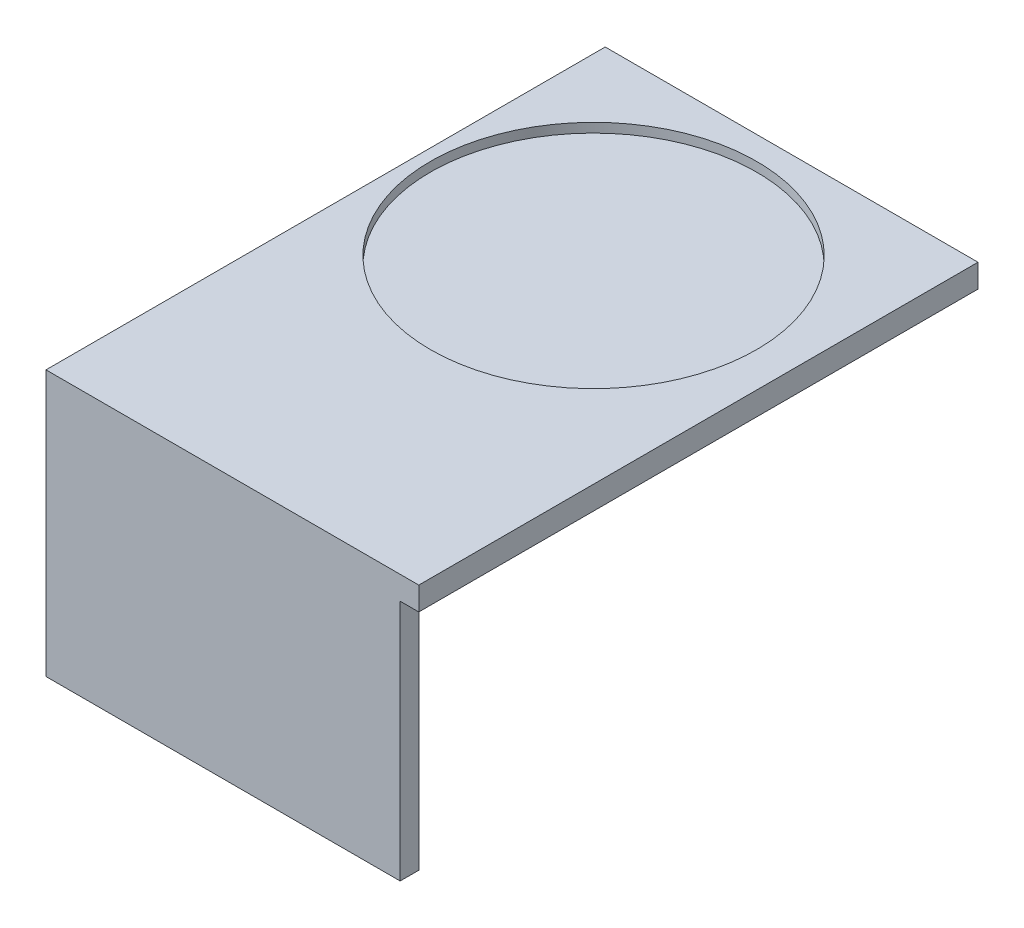
ISO-10303-21;
HEADER;
FILE_DESCRIPTION(('STEP AP214'),'2;1');
FILE_NAME('part.step','',(''),(''),'','','');
FILE_SCHEMA(('AUTOMOTIVE_DESIGN { 1 0 10303 214 1 1 1 1 }'));
ENDSEC;
DATA;
#1=APPLICATION_CONTEXT('core data for automotive mechanical design processes');
#2=APPLICATION_PROTOCOL_DEFINITION('international standard','automotive_design',2000,#1);
#3=PRODUCT_CONTEXT('',#1,'mechanical');
#4=PRODUCT('Part','Part','',(#3));
#5=PRODUCT_RELATED_PRODUCT_CATEGORY('part','',(#4));
#6=PRODUCT_DEFINITION_FORMATION('','',#4);
#7=PRODUCT_DEFINITION_CONTEXT('part definition',#1,'design');
#8=PRODUCT_DEFINITION('design','',#6,#7);
#9=PRODUCT_DEFINITION_SHAPE('','',#8);
#10=(LENGTH_UNIT() NAMED_UNIT(*) SI_UNIT(.MILLI.,.METRE.));
#11=(NAMED_UNIT(*) PLANE_ANGLE_UNIT() SI_UNIT($,.RADIAN.));
#12=(NAMED_UNIT(*) SI_UNIT($,.STERADIAN.) SOLID_ANGLE_UNIT());
#13=UNCERTAINTY_MEASURE_WITH_UNIT(LENGTH_MEASURE(1.E-05),#10,'distance_accuracy_value','');
#14=(GEOMETRIC_REPRESENTATION_CONTEXT(3) GLOBAL_UNCERTAINTY_ASSIGNED_CONTEXT((#13)) GLOBAL_UNIT_ASSIGNED_CONTEXT((#10,
#11,#12)) REPRESENTATION_CONTEXT('',''));
#15=CARTESIAN_POINT('',(0.,0.,0.));
#16=DIRECTION('',(0.,0.,1.));
#17=DIRECTION('',(1.,0.,0.));
#18=AXIS2_PLACEMENT_3D('',#15,#16,#17);
#19=CARTESIAN_POINT('',(0.,0.,0.));
#20=DIRECTION('',(0.,1.,0.));
#21=DIRECTION('',(0.,0.,1.));
#22=AXIS2_PLACEMENT_3D('',#19,#20,#21);
#23=PLANE('',#22);
#24=DIRECTION('',(0.,0.,-1.));
#25=VECTOR('',#24,1.);
#26=CARTESIAN_POINT('',(-33.5,0.,36.));
#27=LINE('',#26,#25);
#28=CARTESIAN_POINT('',(-33.5,0.,36.));
#29=VERTEX_POINT('',#28);
#30=CARTESIAN_POINT('',(-33.5,0.,16.));
#31=VERTEX_POINT('',#30);
#32=EDGE_CURVE('E61',#29,#31,#27,.T.);
#33=ORIENTED_EDGE('',*,*,#32,.T.);
#34=DIRECTION('',(-1.,0.,0.));
#35=VECTOR('',#34,1.);
#36=CARTESIAN_POINT('',(-33.5,0.,16.));
#37=LINE('',#36,#35);
#38=CARTESIAN_POINT('',(-37.5,0.,16.));
#39=VERTEX_POINT('',#38);
#40=EDGE_CURVE('E65',#31,#39,#37,.T.);
#41=ORIENTED_EDGE('',*,*,#40,.T.);
#42=DIRECTION('',(0.,0.,1.));
#43=VECTOR('',#42,1.);
#44=CARTESIAN_POINT('',(-37.5,0.,-80.));
#45=LINE('',#44,#43);
#46=CARTESIAN_POINT('',(-37.5,0.,-20.));
#47=VERTEX_POINT('',#46);
#48=EDGE_CURVE('E287',#47,#39,#45,.T.);
#49=ORIENTED_EDGE('',*,*,#48,.F.);
#50=DIRECTION('',(-1.,0.,0.));
#51=VECTOR('',#50,1.);
#52=CARTESIAN_POINT('',(-33.5,0.,-20.));
#53=LINE('',#52,#51);
#54=CARTESIAN_POINT('',(-33.5,0.,-20.));
#55=VERTEX_POINT('',#54);
#56=EDGE_CURVE('E247',#55,#47,#53,.T.);
#57=ORIENTED_EDGE('',*,*,#56,.F.);
#58=DIRECTION('',(0.,0.,-1.));
#59=VECTOR('',#58,1.);
#60=CARTESIAN_POINT('',(-33.5,0.,-30.));
#61=LINE('',#60,#59);
#62=CARTESIAN_POINT('',(-33.5,0.,-30.));
#63=VERTEX_POINT('',#62);
#64=EDGE_CURVE('E228',#55,#63,#61,.T.);
#65=ORIENTED_EDGE('',*,*,#64,.T.);
#66=DIRECTION('',(-1.,0.,0.));
#67=VECTOR('',#66,1.);
#68=CARTESIAN_POINT('',(-33.5,0.,-30.));
#69=LINE('',#68,#67);
#70=CARTESIAN_POINT('',(-37.5,0.,-30.));
#71=VERTEX_POINT('',#70);
#72=EDGE_CURVE('E242',#63,#71,#69,.T.);
#73=ORIENTED_EDGE('',*,*,#72,.T.);
#74=CARTESIAN_POINT('',(-37.5,0.,-80.));
#75=VERTEX_POINT('',#74);
#76=EDGE_CURVE('E305',#75,#71,#45,.T.);
#77=ORIENTED_EDGE('',*,*,#76,.F.);
#78=DIRECTION('',(1.,0.,0.));
#79=VECTOR('',#78,1.);
#80=CARTESIAN_POINT('',(-37.5,0.,-80.));
#81=LINE('',#80,#79);
#82=CARTESIAN_POINT('',(42.5,0.,-80.));
#83=VERTEX_POINT('',#82);
#84=EDGE_CURVE('E293',#75,#83,#81,.T.);
#85=ORIENTED_EDGE('',*,*,#84,.T.);
#86=DIRECTION('',(0.,0.,1.));
#87=VECTOR('',#86,1.);
#88=CARTESIAN_POINT('',(42.5,0.,-80.));
#89=LINE('',#88,#87);
#90=CARTESIAN_POINT('',(42.5,0.,40.));
#91=VERTEX_POINT('',#90);
#92=EDGE_CURVE('E312',#83,#91,#89,.T.);
#93=ORIENTED_EDGE('',*,*,#92,.T.);
#94=DIRECTION('',(1.,0.,0.));
#95=VECTOR('',#94,1.);
#96=CARTESIAN_POINT('',(-37.5,0.,40.));
#97=LINE('',#96,#95);
#98=CARTESIAN_POINT('',(38.5,0.,40.));
#99=VERTEX_POINT('',#98);
#100=EDGE_CURVE('E309',#99,#91,#97,.T.);
#101=ORIENTED_EDGE('',*,*,#100,.F.);
#102=DIRECTION('',(0.,0.,1.));
#103=VECTOR('',#102,1.);
#104=CARTESIAN_POINT('',(38.5,0.,40.));
#105=LINE('',#104,#103);
#106=CARTESIAN_POINT('',(38.5,0.,36.));
#107=VERTEX_POINT('',#106);
#108=EDGE_CURVE('E261',#107,#99,#105,.T.);
#109=ORIENTED_EDGE('',*,*,#108,.F.);
#110=DIRECTION('',(1.,0.,0.));
#111=VECTOR('',#110,1.);
#112=CARTESIAN_POINT('',(38.5,0.,36.));
#113=LINE('',#112,#111);
#114=EDGE_CURVE('E246',#29,#107,#113,.T.);
#115=ORIENTED_EDGE('',*,*,#114,.F.);
#116=EDGE_LOOP('',(#33,#41,#49,#57,#65,#73,#77,#85,#93,#101,#109,#115));
#117=FACE_BOUND('',#116,.T.);
#118=ADVANCED_FACE('F45',(#117),#23,.F.);
#119=CARTESIAN_POINT('',(-37.5,5.,-80.));
#120=DIRECTION('',(1.,0.,0.));
#121=DIRECTION('',(0.,0.,-1.));
#122=AXIS2_PLACEMENT_3D('',#119,#120,#121);
#123=PLANE('',#122);
#124=ORIENTED_EDGE('',*,*,#48,.T.);
#125=DIRECTION('',(0.,-1.,0.));
#126=VECTOR('',#125,1.);
#127=CARTESIAN_POINT('',(-37.5,0.,16.));
#128=LINE('',#127,#126);
#129=CARTESIAN_POINT('',(-37.5,-5.,16.));
#130=VERTEX_POINT('',#129);
#131=EDGE_CURVE('E180',#39,#130,#128,.T.);
#132=ORIENTED_EDGE('',*,*,#131,.T.);
#133=CARTESIAN_POINT('',(-37.5,-4.99999999999999,21.));
#134=DIRECTION('',(-1.,0.,0.));
#135=DIRECTION('',(0.,0.,-1.));
#136=AXIS2_PLACEMENT_3D('',#133,#134,#135);
#137=CIRCLE('',#136,5.);
#138=CARTESIAN_POINT('',(-37.5,-9.76627109438971,19.4891526037402));
#139=VERTEX_POINT('',#138);
#140=EDGE_CURVE('E195',#130,#139,#137,.T.);
#141=ORIENTED_EDGE('',*,*,#140,.T.);
#142=DIRECTION('',(0.,-0.302169479251963,0.953254218877943));
#143=VECTOR('',#142,1.);
#144=CARTESIAN_POINT('',(-37.5,-9.76627109438971,19.4891526037402));
#145=LINE('',#144,#143);
#146=CARTESIAN_POINT('',(-37.5,-15.,36.));
#147=VERTEX_POINT('',#146);
#148=EDGE_CURVE('E158',#139,#147,#145,.T.);
#149=ORIENTED_EDGE('',*,*,#148,.T.);
#150=DIRECTION('',(0.,1.,0.));
#151=VECTOR('',#150,1.);
#152=CARTESIAN_POINT('',(-37.5,-52.,36.));
#153=LINE('',#152,#151);
#154=CARTESIAN_POINT('',(-37.5,-52.,36.));
#155=VERTEX_POINT('',#154);
#156=EDGE_CURVE('E284',#155,#147,#153,.T.);
#157=ORIENTED_EDGE('',*,*,#156,.F.);
#158=DIRECTION('',(0.,0.,-1.));
#159=VECTOR('',#158,1.);
#160=CARTESIAN_POINT('',(-37.5,-52.,36.));
#161=LINE('',#160,#159);
#162=CARTESIAN_POINT('',(-37.5,-52.,40.));
#163=VERTEX_POINT('',#162);
#164=EDGE_CURVE('E256',#163,#155,#161,.T.);
#165=ORIENTED_EDGE('',*,*,#164,.F.);
#166=DIRECTION('',(0.,-1.,0.));
#167=VECTOR('',#166,1.);
#168=CARTESIAN_POINT('',(-37.5,5.,40.));
#169=LINE('',#168,#167);
#170=CARTESIAN_POINT('',(-37.5,5.,40.));
#171=VERTEX_POINT('',#170);
#172=EDGE_CURVE('E11',#171,#163,#169,.T.);
#173=ORIENTED_EDGE('',*,*,#172,.F.);
#174=DIRECTION('',(0.,0.,1.));
#175=VECTOR('',#174,1.);
#176=CARTESIAN_POINT('',(-37.5,5.,-80.));
#177=LINE('',#176,#175);
#178=CARTESIAN_POINT('',(-37.5,5.,-80.));
#179=VERTEX_POINT('',#178);
#180=EDGE_CURVE('E288',#179,#171,#177,.T.);
#181=ORIENTED_EDGE('',*,*,#180,.F.);
#182=DIRECTION('',(0.,-1.,0.));
#183=VECTOR('',#182,1.);
#184=CARTESIAN_POINT('',(-37.5,5.,-80.));
#185=LINE('',#184,#183);
#186=EDGE_CURVE('E304',#179,#75,#185,.T.);
#187=ORIENTED_EDGE('',*,*,#186,.T.);
#188=ORIENTED_EDGE('',*,*,#76,.T.);
#189=DIRECTION('',(0.,-1.,0.));
#190=VECTOR('',#189,1.);
#191=CARTESIAN_POINT('',(-37.5,0.,-30.));
#192=LINE('',#191,#190);
#193=CARTESIAN_POINT('',(-37.5,-5.,-30.));
#194=VERTEX_POINT('',#193);
#195=EDGE_CURVE('E212',#71,#194,#192,.T.);
#196=ORIENTED_EDGE('',*,*,#195,.T.);
#197=CARTESIAN_POINT('',(-37.5,-5.,-25.));
#198=DIRECTION('',(-1.,0.,0.));
#199=DIRECTION('',(0.,0.,1.));
#200=AXIS2_PLACEMENT_3D('',#197,#198,#199);
#201=CIRCLE('',#200,5.);
#202=CARTESIAN_POINT('',(-37.5,-5.,-20.));
#203=VERTEX_POINT('',#202);
#204=EDGE_CURVE('E236',#194,#203,#201,.T.);
#205=ORIENTED_EDGE('',*,*,#204,.T.);
#206=DIRECTION('',(0.,1.,0.));
#207=VECTOR('',#206,1.);
#208=CARTESIAN_POINT('',(-37.5,0.,-20.));
#209=LINE('',#208,#207);
#210=EDGE_CURVE('E221',#203,#47,#209,.T.);
#211=ORIENTED_EDGE('',*,*,#210,.T.);
#212=EDGE_LOOP('',(#124,#132,#141,#149,#157,#165,#173,#181,#187,#188,#196,#205,#211));
#213=FACE_BOUND('',#212,.T.);
#214=CARTESIAN_POINT('',(-37.5,-5.,-25.));
#215=DIRECTION('',(-1.,0.,0.));
#216=DIRECTION('',(0.,0.,1.));
#217=AXIS2_PLACEMENT_3D('',#214,#215,#216);
#218=CIRCLE('',#217,3.41);
#219=CARTESIAN_POINT('',(-37.5,-5.,-21.59));
#220=VERTEX_POINT('',#219);
#221=EDGE_CURVE('E203',#220,#220,#218,.T.);
#222=ORIENTED_EDGE('',*,*,#221,.F.);
#223=EDGE_LOOP('',(#222));
#224=FACE_BOUND('',#223,.T.);
#225=CARTESIAN_POINT('',(-37.5,-4.99999999999999,21.));
#226=DIRECTION('',(-1.,0.,0.));
#227=DIRECTION('',(0.,0.,-1.));
#228=AXIS2_PLACEMENT_3D('',#225,#226,#227);
#229=CIRCLE('',#228,3.41);
#230=CARTESIAN_POINT('',(-37.5,-4.99999999999999,17.59));
#231=VERTEX_POINT('',#230);
#232=EDGE_CURVE('E186',#231,#231,#229,.T.);
#233=ORIENTED_EDGE('',*,*,#232,.F.);
#234=EDGE_LOOP('',(#233));
#235=FACE_BOUND('',#234,.T.);
#236=ADVANCED_FACE('F47',(#213,#224,#235),#123,.F.);
#237=CARTESIAN_POINT('',(-37.5,5.,40.));
#238=DIRECTION('',(0.,0.,-1.));
#239=DIRECTION('',(-1.,0.,0.));
#240=AXIS2_PLACEMENT_3D('',#237,#238,#239);
#241=PLANE('',#240);
#242=ORIENTED_EDGE('',*,*,#172,.T.);
#243=DIRECTION('',(-1.,0.,0.));
#244=VECTOR('',#243,1.);
#245=CARTESIAN_POINT('',(-37.5,-52.,40.));
#246=LINE('',#245,#244);
#247=CARTESIAN_POINT('',(38.5,-52.,40.));
#248=VERTEX_POINT('',#247);
#249=EDGE_CURVE('E267',#248,#163,#246,.T.);
#250=ORIENTED_EDGE('',*,*,#249,.F.);
#251=DIRECTION('',(0.,1.,0.));
#252=VECTOR('',#251,1.);
#253=CARTESIAN_POINT('',(38.5,-52.,40.));
#254=LINE('',#253,#252);
#255=EDGE_CURVE('E271',#248,#99,#254,.T.);
#256=ORIENTED_EDGE('',*,*,#255,.T.);
#257=ORIENTED_EDGE('',*,*,#100,.T.);
#258=DIRECTION('',(0.,-1.,0.));
#259=VECTOR('',#258,1.);
#260=CARTESIAN_POINT('',(42.5,5.,40.));
#261=LINE('',#260,#259);
#262=CARTESIAN_POINT('',(42.5,5.,40.));
#263=VERTEX_POINT('',#262);
#264=EDGE_CURVE('E54',#263,#91,#261,.T.);
#265=ORIENTED_EDGE('',*,*,#264,.F.);
#266=DIRECTION('',(1.,0.,0.));
#267=VECTOR('',#266,1.);
#268=CARTESIAN_POINT('',(-37.5,5.,40.));
#269=LINE('',#268,#267);
#270=EDGE_CURVE('E292',#171,#263,#269,.T.);
#271=ORIENTED_EDGE('',*,*,#270,.F.);
#272=EDGE_LOOP('',(#242,#250,#256,#257,#265,#271));
#273=FACE_BOUND('',#272,.T.);
#274=ADVANCED_FACE('F341',(#273),#241,.F.);
#275=CARTESIAN_POINT('',(42.5,5.,-80.));
#276=DIRECTION('',(1.,0.,0.));
#277=DIRECTION('',(0.,0.,-1.));
#278=AXIS2_PLACEMENT_3D('',#275,#276,#277);
#279=PLANE('',#278);
#280=ORIENTED_EDGE('',*,*,#92,.F.);
#281=DIRECTION('',(0.,-1.,0.));
#282=VECTOR('',#281,1.);
#283=CARTESIAN_POINT('',(42.5,5.,-80.));
#284=LINE('',#283,#282);
#285=CARTESIAN_POINT('',(42.5,5.,-80.));
#286=VERTEX_POINT('',#285);
#287=EDGE_CURVE('E321',#286,#83,#284,.T.);
#288=ORIENTED_EDGE('',*,*,#287,.F.);
#289=DIRECTION('',(0.,0.,1.));
#290=VECTOR('',#289,1.);
#291=CARTESIAN_POINT('',(42.5,5.,-80.));
#292=LINE('',#291,#290);
#293=EDGE_CURVE('E296',#286,#263,#292,.T.);
#294=ORIENTED_EDGE('',*,*,#293,.T.);
#295=ORIENTED_EDGE('',*,*,#264,.T.);
#296=EDGE_LOOP('',(#280,#288,#294,#295));
#297=FACE_BOUND('',#296,.T.);
#298=ADVANCED_FACE('F328',(#297),#279,.T.);
#299=CARTESIAN_POINT('',(-37.5,5.,-80.));
#300=DIRECTION('',(0.,0.,-1.));
#301=DIRECTION('',(-1.,0.,0.));
#302=AXIS2_PLACEMENT_3D('',#299,#300,#301);
#303=PLANE('',#302);
#304=ORIENTED_EDGE('',*,*,#84,.F.);
#305=ORIENTED_EDGE('',*,*,#186,.F.);
#306=DIRECTION('',(1.,0.,0.));
#307=VECTOR('',#306,1.);
#308=CARTESIAN_POINT('',(-37.5,5.,-80.));
#309=LINE('',#308,#307);
#310=EDGE_CURVE('E300',#179,#286,#309,.T.);
#311=ORIENTED_EDGE('',*,*,#310,.T.);
#312=ORIENTED_EDGE('',*,*,#287,.T.);
#313=EDGE_LOOP('',(#304,#305,#311,#312));
#314=FACE_BOUND('',#313,.T.);
#315=ADVANCED_FACE('F335',(#314),#303,.T.);
#316=CARTESIAN_POINT('',(0.,5.,0.));
#317=DIRECTION('',(0.,1.,0.));
#318=DIRECTION('',(0.,0.,1.));
#319=AXIS2_PLACEMENT_3D('',#316,#317,#318);
#320=PLANE('',#319);
#321=CARTESIAN_POINT('',(0.,5.,-40.));
#322=DIRECTION('',(0.,1.,0.));
#323=DIRECTION('',(0.,0.,1.));
#324=AXIS2_PLACEMENT_3D('',#321,#322,#323);
#325=CIRCLE('',#324,35.);
#326=CARTESIAN_POINT('',(0.,5.,-4.99999999999999));
#327=VERTEX_POINT('',#326);
#328=EDGE_CURVE('E534',#327,#327,#325,.T.);
#329=ORIENTED_EDGE('',*,*,#328,.F.);
#330=EDGE_LOOP('',(#329));
#331=FACE_BOUND('',#330,.T.);
#332=ORIENTED_EDGE('',*,*,#180,.T.);
#333=ORIENTED_EDGE('',*,*,#270,.T.);
#334=ORIENTED_EDGE('',*,*,#293,.F.);
#335=ORIENTED_EDGE('',*,*,#310,.F.);
#336=EDGE_LOOP('',(#332,#333,#334,#335));
#337=FACE_BOUND('',#336,.T.);
#338=ADVANCED_FACE('F339',(#331,#337),#320,.T.);
#339=CARTESIAN_POINT('',(38.5,-52.,36.));
#340=DIRECTION('',(0.,0.,1.));
#341=DIRECTION('',(1.,0.,0.));
#342=AXIS2_PLACEMENT_3D('',#339,#340,#341);
#343=PLANE('',#342);
#344=ORIENTED_EDGE('',*,*,#156,.T.);
#345=DIRECTION('',(-1.,0.,0.));
#346=VECTOR('',#345,1.);
#347=CARTESIAN_POINT('',(-33.5,-15.,36.));
#348=LINE('',#347,#346);
#349=CARTESIAN_POINT('',(-33.5,-15.,36.));
#350=VERTEX_POINT('',#349);
#351=EDGE_CURVE('E164',#350,#147,#348,.T.);
#352=ORIENTED_EDGE('',*,*,#351,.F.);
#353=DIRECTION('',(0.,1.,0.));
#354=VECTOR('',#353,1.);
#355=CARTESIAN_POINT('',(-33.5,-15.,36.));
#356=LINE('',#355,#354);
#357=EDGE_CURVE('E174',#350,#29,#356,.T.);
#358=ORIENTED_EDGE('',*,*,#357,.T.);
#359=ORIENTED_EDGE('',*,*,#114,.T.);
#360=DIRECTION('',(0.,1.,0.));
#361=VECTOR('',#360,1.);
#362=CARTESIAN_POINT('',(38.5,-52.,36.));
#363=LINE('',#362,#361);
#364=CARTESIAN_POINT('',(38.5,-52.,36.));
#365=VERTEX_POINT('',#364);
#366=EDGE_CURVE('E280',#365,#107,#363,.T.);
#367=ORIENTED_EDGE('',*,*,#366,.F.);
#368=DIRECTION('',(1.,0.,0.));
#369=VECTOR('',#368,1.);
#370=CARTESIAN_POINT('',(38.5,-52.,36.));
#371=LINE('',#370,#369);
#372=EDGE_CURVE('E260',#155,#365,#371,.T.);
#373=ORIENTED_EDGE('',*,*,#372,.F.);
#374=EDGE_LOOP('',(#344,#352,#358,#359,#367,#373));
#375=FACE_BOUND('',#374,.T.);
#376=ADVANCED_FACE('F352',(#375),#343,.F.);
#377=CARTESIAN_POINT('',(38.5,-52.,40.));
#378=DIRECTION('',(-1.,0.,0.));
#379=DIRECTION('',(0.,0.,1.));
#380=AXIS2_PLACEMENT_3D('',#377,#378,#379);
#381=PLANE('',#380);
#382=ORIENTED_EDGE('',*,*,#108,.T.);
#383=ORIENTED_EDGE('',*,*,#255,.F.);
#384=DIRECTION('',(0.,0.,1.));
#385=VECTOR('',#384,1.);
#386=CARTESIAN_POINT('',(38.5,-52.,40.));
#387=LINE('',#386,#385);
#388=EDGE_CURVE('E264',#365,#248,#387,.T.);
#389=ORIENTED_EDGE('',*,*,#388,.F.);
#390=ORIENTED_EDGE('',*,*,#366,.T.);
#391=EDGE_LOOP('',(#382,#383,#389,#390));
#392=FACE_BOUND('',#391,.T.);
#393=ADVANCED_FACE('F355',(#392),#381,.F.);
#394=CARTESIAN_POINT('',(0.,-52.,0.));
#395=DIRECTION('',(0.,1.,0.));
#396=DIRECTION('',(0.,0.,1.));
#397=AXIS2_PLACEMENT_3D('',#394,#395,#396);
#398=PLANE('',#397);
#399=ORIENTED_EDGE('',*,*,#164,.T.);
#400=ORIENTED_EDGE('',*,*,#372,.T.);
#401=ORIENTED_EDGE('',*,*,#388,.T.);
#402=ORIENTED_EDGE('',*,*,#249,.T.);
#403=EDGE_LOOP('',(#399,#400,#401,#402));
#404=FACE_BOUND('',#403,.T.);
#405=ADVANCED_FACE('F346',(#404),#398,.F.);
#406=CARTESIAN_POINT('',(-33.5,0.,-30.));
#407=DIRECTION('',(0.,0.,-1.));
#408=DIRECTION('',(-1.,0.,0.));
#409=AXIS2_PLACEMENT_3D('',#406,#407,#408);
#410=PLANE('',#409);
#411=ORIENTED_EDGE('',*,*,#195,.F.);
#412=ORIENTED_EDGE('',*,*,#72,.F.);
#413=DIRECTION('',(0.,-1.,0.));
#414=VECTOR('',#413,1.);
#415=CARTESIAN_POINT('',(-33.5,0.,-30.));
#416=LINE('',#415,#414);
#417=CARTESIAN_POINT('',(-33.5,-5.,-30.));
#418=VERTEX_POINT('',#417);
#419=EDGE_CURVE('E216',#63,#418,#416,.T.);
#420=ORIENTED_EDGE('',*,*,#419,.T.);
#421=DIRECTION('',(-1.,0.,0.));
#422=VECTOR('',#421,1.);
#423=CARTESIAN_POINT('',(-33.5,-5.,-30.));
#424=LINE('',#423,#422);
#425=EDGE_CURVE('E232',#418,#194,#424,.T.);
#426=ORIENTED_EDGE('',*,*,#425,.T.);
#427=EDGE_LOOP('',(#411,#412,#420,#426));
#428=FACE_BOUND('',#427,.T.);
#429=ADVANCED_FACE('F371',(#428),#410,.T.);
#430=CARTESIAN_POINT('',(-33.5,0.,-20.));
#431=DIRECTION('',(0.,0.,1.));
#432=DIRECTION('',(0.,-1.,0.));
#433=AXIS2_PLACEMENT_3D('',#430,#431,#432);
#434=PLANE('',#433);
#435=ORIENTED_EDGE('',*,*,#210,.F.);
#436=DIRECTION('',(-1.,0.,0.));
#437=VECTOR('',#436,1.);
#438=CARTESIAN_POINT('',(-33.5,-5.,-20.));
#439=LINE('',#438,#437);
#440=CARTESIAN_POINT('',(-33.5,-5.,-20.));
#441=VERTEX_POINT('',#440);
#442=EDGE_CURVE('E251',#441,#203,#439,.T.);
#443=ORIENTED_EDGE('',*,*,#442,.F.);
#444=DIRECTION('',(0.,1.,0.));
#445=VECTOR('',#444,1.);
#446=CARTESIAN_POINT('',(-33.5,0.,-20.));
#447=LINE('',#446,#445);
#448=EDGE_CURVE('E225',#441,#55,#447,.T.);
#449=ORIENTED_EDGE('',*,*,#448,.T.);
#450=ORIENTED_EDGE('',*,*,#56,.T.);
#451=EDGE_LOOP('',(#435,#443,#449,#450));
#452=FACE_BOUND('',#451,.T.);
#453=ADVANCED_FACE('F364',(#452),#434,.T.);
#454=CARTESIAN_POINT('',(-33.5,-5.,-25.));
#455=DIRECTION('',(-1.,0.,0.));
#456=DIRECTION('',(0.,0.,1.));
#457=AXIS2_PLACEMENT_3D('',#454,#455,#456);
#458=CYLINDRICAL_SURFACE('',#457,5.);
#459=ORIENTED_EDGE('',*,*,#204,.F.);
#460=ORIENTED_EDGE('',*,*,#425,.F.);
#461=CARTESIAN_POINT('',(-33.5,-5.,-25.));
#462=DIRECTION('',(-1.,0.,0.));
#463=DIRECTION('',(0.,0.,1.));
#464=AXIS2_PLACEMENT_3D('',#461,#462,#463);
#465=CIRCLE('',#464,5.);
#466=EDGE_CURVE('E220',#418,#441,#465,.T.);
#467=ORIENTED_EDGE('',*,*,#466,.T.);
#468=ORIENTED_EDGE('',*,*,#442,.T.);
#469=EDGE_LOOP('',(#459,#460,#467,#468));
#470=FACE_BOUND('',#469,.T.);
#471=ADVANCED_FACE('F374',(#470),#458,.T.);
#472=CARTESIAN_POINT('',(-33.5,-5.,-25.));
#473=DIRECTION('',(-1.,0.,0.));
#474=DIRECTION('',(0.,0.,1.));
#475=AXIS2_PLACEMENT_3D('',#472,#473,#474);
#476=PLANE('',#475);
#477=CARTESIAN_POINT('',(-33.5,-5.,-25.));
#478=DIRECTION('',(-1.,0.,0.));
#479=DIRECTION('',(0.,0.,1.));
#480=AXIS2_PLACEMENT_3D('',#477,#478,#479);
#481=CIRCLE('',#480,3.41);
#482=CARTESIAN_POINT('',(-33.5,-5.,-21.59));
#483=VERTEX_POINT('',#482);
#484=EDGE_CURVE('E208',#483,#483,#481,.T.);
#485=ORIENTED_EDGE('',*,*,#484,.T.);
#486=EDGE_LOOP('',(#485));
#487=FACE_BOUND('',#486,.T.);
#488=ORIENTED_EDGE('',*,*,#419,.F.);
#489=ORIENTED_EDGE('',*,*,#64,.F.);
#490=ORIENTED_EDGE('',*,*,#448,.F.);
#491=ORIENTED_EDGE('',*,*,#466,.F.);
#492=EDGE_LOOP('',(#488,#489,#490,#491));
#493=FACE_BOUND('',#492,.T.);
#494=ADVANCED_FACE('F369',(#487,#493),#476,.F.);
#495=CARTESIAN_POINT('',(-33.5,-5.,-25.));
#496=DIRECTION('',(-1.,0.,0.));
#497=DIRECTION('',(0.,0.,1.));
#498=AXIS2_PLACEMENT_3D('',#495,#496,#497);
#499=CYLINDRICAL_SURFACE('',#498,3.41);
#500=ORIENTED_EDGE('',*,*,#484,.F.);
#501=EDGE_LOOP('',(#500));
#502=FACE_BOUND('',#501,.T.);
#503=ORIENTED_EDGE('',*,*,#221,.T.);
#504=EDGE_LOOP('',(#503));
#505=FACE_BOUND('',#504,.T.);
#506=ADVANCED_FACE('F381',(#502,#505),#499,.F.);
#507=CARTESIAN_POINT('',(-33.5,-4.99999999999999,21.));
#508=DIRECTION('',(-1.,0.,0.));
#509=DIRECTION('',(0.,0.,1.));
#510=AXIS2_PLACEMENT_3D('',#507,#508,#509);
#511=CYLINDRICAL_SURFACE('',#510,5.);
#512=ORIENTED_EDGE('',*,*,#140,.F.);
#513=DIRECTION('',(-1.,0.,0.));
#514=VECTOR('',#513,1.);
#515=CARTESIAN_POINT('',(-33.5,-5.,16.));
#516=LINE('',#515,#514);
#517=CARTESIAN_POINT('',(-33.5,-5.,16.));
#518=VERTEX_POINT('',#517);
#519=EDGE_CURVE('E178',#518,#130,#516,.T.);
#520=ORIENTED_EDGE('',*,*,#519,.F.);
#521=CARTESIAN_POINT('',(-33.5,-4.99999999999999,21.));
#522=DIRECTION('',(-1.,0.,0.));
#523=DIRECTION('',(0.,0.,-1.));
#524=AXIS2_PLACEMENT_3D('',#521,#522,#523);
#525=CIRCLE('',#524,5.);
#526=CARTESIAN_POINT('',(-33.5,-9.76627109438971,19.4891526037402));
#527=VERTEX_POINT('',#526);
#528=EDGE_CURVE('E172',#518,#527,#525,.T.);
#529=ORIENTED_EDGE('',*,*,#528,.T.);
#530=DIRECTION('',(-1.,0.,0.));
#531=VECTOR('',#530,1.);
#532=CARTESIAN_POINT('',(-33.5,-9.76627109438971,19.4891526037402));
#533=LINE('',#532,#531);
#534=EDGE_CURVE('E152',#527,#139,#533,.T.);
#535=ORIENTED_EDGE('',*,*,#534,.T.);
#536=EDGE_LOOP('',(#512,#520,#529,#535));
#537=FACE_BOUND('',#536,.T.);
#538=ADVANCED_FACE('F177',(#537),#511,.T.);
#539=CARTESIAN_POINT('',(-33.5,0.,16.));
#540=DIRECTION('',(0.,0.,-1.));
#541=DIRECTION('',(0.,1.,0.));
#542=AXIS2_PLACEMENT_3D('',#539,#540,#541);
#543=PLANE('',#542);
#544=ORIENTED_EDGE('',*,*,#131,.F.);
#545=ORIENTED_EDGE('',*,*,#40,.F.);
#546=DIRECTION('',(0.,-1.,0.));
#547=VECTOR('',#546,1.);
#548=CARTESIAN_POINT('',(-33.5,0.,16.));
#549=LINE('',#548,#547);
#550=EDGE_CURVE('E165',#31,#518,#549,.T.);
#551=ORIENTED_EDGE('',*,*,#550,.T.);
#552=ORIENTED_EDGE('',*,*,#519,.T.);
#553=EDGE_LOOP('',(#544,#545,#551,#552));
#554=FACE_BOUND('',#553,.T.);
#555=ADVANCED_FACE('F358',(#554),#543,.T.);
#556=CARTESIAN_POINT('',(-33.5,-9.76627109438971,19.4891526037402));
#557=DIRECTION('',(0.,-0.953254218877943,-0.302169479251963));
#558=DIRECTION('',(0.,0.302169479251963,-0.953254218877943));
#559=AXIS2_PLACEMENT_3D('',#556,#557,#558);
#560=PLANE('',#559);
#561=ORIENTED_EDGE('',*,*,#148,.F.);
#562=ORIENTED_EDGE('',*,*,#534,.F.);
#563=DIRECTION('',(0.,-0.302169479251963,0.953254218877943));
#564=VECTOR('',#563,1.);
#565=CARTESIAN_POINT('',(-33.5,-9.76627109438971,19.4891526037402));
#566=LINE('',#565,#564);
#567=EDGE_CURVE('E156',#527,#350,#566,.T.);
#568=ORIENTED_EDGE('',*,*,#567,.T.);
#569=ORIENTED_EDGE('',*,*,#351,.T.);
#570=EDGE_LOOP('',(#561,#562,#568,#569));
#571=FACE_BOUND('',#570,.T.);
#572=ADVANCED_FACE('F154',(#571),#560,.T.);
#573=CARTESIAN_POINT('',(-33.5,-4.99999999999999,21.));
#574=DIRECTION('',(1.,0.,0.));
#575=DIRECTION('',(0.,0.,-1.));
#576=AXIS2_PLACEMENT_3D('',#573,#574,#575);
#577=PLANE('',#576);
#578=CARTESIAN_POINT('',(-33.5,-4.99999999999999,21.));
#579=DIRECTION('',(-1.,0.,0.));
#580=DIRECTION('',(0.,0.,-1.));
#581=AXIS2_PLACEMENT_3D('',#578,#579,#580);
#582=CIRCLE('',#581,3.41);
#583=CARTESIAN_POINT('',(-33.5,-4.99999999999999,17.59));
#584=VERTEX_POINT('',#583);
#585=EDGE_CURVE('E198',#584,#584,#582,.T.);
#586=ORIENTED_EDGE('',*,*,#585,.T.);
#587=EDGE_LOOP('',(#586));
#588=FACE_BOUND('',#587,.T.);
#589=ORIENTED_EDGE('',*,*,#528,.F.);
#590=ORIENTED_EDGE('',*,*,#550,.F.);
#591=ORIENTED_EDGE('',*,*,#32,.F.);
#592=ORIENTED_EDGE('',*,*,#357,.F.);
#593=ORIENTED_EDGE('',*,*,#567,.F.);
#594=EDGE_LOOP('',(#589,#590,#591,#592,#593));
#595=FACE_BOUND('',#594,.T.);
#596=ADVANCED_FACE('F170',(#588,#595),#577,.T.);
#597=CARTESIAN_POINT('',(-33.5,-4.99999999999999,21.));
#598=DIRECTION('',(-1.,0.,0.));
#599=DIRECTION('',(0.,0.,1.));
#600=AXIS2_PLACEMENT_3D('',#597,#598,#599);
#601=CYLINDRICAL_SURFACE('',#600,3.41);
#602=ORIENTED_EDGE('',*,*,#585,.F.);
#603=EDGE_LOOP('',(#602));
#604=FACE_BOUND('',#603,.T.);
#605=ORIENTED_EDGE('',*,*,#232,.T.);
#606=EDGE_LOOP('',(#605));
#607=FACE_BOUND('',#606,.T.);
#608=ADVANCED_FACE('F496',(#604,#607),#601,.F.);
#609=CARTESIAN_POINT('',(0.,3.,-40.));
#610=DIRECTION('',(0.,1.,0.));
#611=DIRECTION('',(0.,0.,1.));
#612=AXIS2_PLACEMENT_3D('',#609,#610,#611);
#613=CYLINDRICAL_SURFACE('',#612,35.);
#614=CARTESIAN_POINT('',(0.,3.,-40.));
#615=DIRECTION('',(0.,1.,0.));
#616=DIRECTION('',(0.,0.,1.));
#617=AXIS2_PLACEMENT_3D('',#614,#615,#616);
#618=CIRCLE('',#617,35.);
#619=CARTESIAN_POINT('',(0.,3.,-4.99999999999999));
#620=VERTEX_POINT('',#619);
#621=EDGE_CURVE('E532',#620,#620,#618,.T.);
#622=ORIENTED_EDGE('',*,*,#621,.F.);
#623=EDGE_LOOP('',(#622));
#624=FACE_BOUND('',#623,.T.);
#625=ORIENTED_EDGE('',*,*,#328,.T.);
#626=EDGE_LOOP('',(#625));
#627=FACE_BOUND('',#626,.T.);
#628=ADVANCED_FACE('F506',(#624,#627),#613,.F.);
#629=CARTESIAN_POINT('',(0.,3.,-40.));
#630=DIRECTION('',(0.,1.,0.));
#631=DIRECTION('',(0.,0.,1.));
#632=AXIS2_PLACEMENT_3D('',#629,#630,#631);
#633=PLANE('',#632);
#634=ORIENTED_EDGE('',*,*,#621,.T.);
#635=EDGE_LOOP('',(#634));
#636=FACE_BOUND('',#635,.T.);
#637=ADVANCED_FACE('F517',(#636),#633,.T.);
#638=CLOSED_SHELL('',(#118,#236,#274,#298,#315,#338,#376,#393,#405,#429,#453,#471,#494,#506,
#538,#555,#572,#596,#608,#628,#637));
#639=MANIFOLD_SOLID_BREP('B2',#638);
#640=ADVANCED_BREP_SHAPE_REPRESENTATION('',(#18,#639),#14);
#641=SHAPE_DEFINITION_REPRESENTATION(#9,#640);
ENDSEC;
END-ISO-10303-21;
